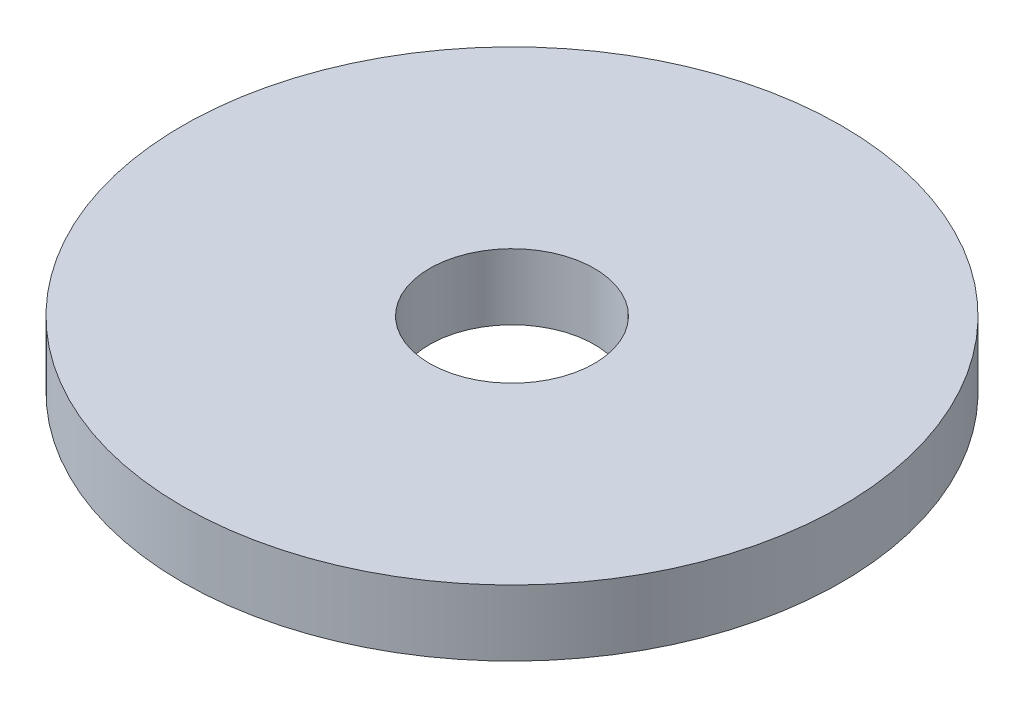
ISO-10303-21;
HEADER;
FILE_DESCRIPTION(('STEP AP214'),'2;1');
FILE_NAME('part.step','',(''),(''),'','','');
FILE_SCHEMA(('AUTOMOTIVE_DESIGN { 1 0 10303 214 1 1 1 1 }'));
ENDSEC;
DATA;
#1=APPLICATION_CONTEXT('core data for automotive mechanical design processes');
#2=APPLICATION_PROTOCOL_DEFINITION('international standard','automotive_design',2000,#1);
#3=PRODUCT_CONTEXT('',#1,'mechanical');
#4=PRODUCT('Part','Part','',(#3));
#5=PRODUCT_RELATED_PRODUCT_CATEGORY('part','',(#4));
#6=PRODUCT_DEFINITION_FORMATION('','',#4);
#7=PRODUCT_DEFINITION_CONTEXT('part definition',#1,'design');
#8=PRODUCT_DEFINITION('design','',#6,#7);
#9=PRODUCT_DEFINITION_SHAPE('','',#8);
#10=(LENGTH_UNIT() NAMED_UNIT(*) SI_UNIT(.MILLI.,.METRE.));
#11=(NAMED_UNIT(*) PLANE_ANGLE_UNIT() SI_UNIT($,.RADIAN.));
#12=(NAMED_UNIT(*) SI_UNIT($,.STERADIAN.) SOLID_ANGLE_UNIT());
#13=UNCERTAINTY_MEASURE_WITH_UNIT(LENGTH_MEASURE(1.E-05),#10,'distance_accuracy_value','');
#14=(GEOMETRIC_REPRESENTATION_CONTEXT(3) GLOBAL_UNCERTAINTY_ASSIGNED_CONTEXT((#13)) GLOBAL_UNIT_ASSIGNED_CONTEXT((#10,
#11,#12)) REPRESENTATION_CONTEXT('',''));
#15=CARTESIAN_POINT('',(0.,0.,0.));
#16=DIRECTION('',(0.,0.,1.));
#17=DIRECTION('',(1.,0.,0.));
#18=AXIS2_PLACEMENT_3D('',#15,#16,#17);
#19=CARTESIAN_POINT('',(0.,4.,0.));
#20=DIRECTION('',(0.,-1.,0.));
#21=DIRECTION('',(0.,0.,-1.));
#22=AXIS2_PLACEMENT_3D('',#19,#20,#21);
#23=CYLINDRICAL_SURFACE('',#22,20.);
#24=CARTESIAN_POINT('',(0.,4.,0.));
#25=DIRECTION('',(0.,1.,0.));
#26=DIRECTION('',(0.,0.,1.));
#27=AXIS2_PLACEMENT_3D('',#24,#25,#26);
#28=CIRCLE('',#27,20.);
#29=CARTESIAN_POINT('',(0.,4.,20.));
#30=VERTEX_POINT('',#29);
#31=EDGE_CURVE('E12',#30,#30,#28,.T.);
#32=ORIENTED_EDGE('',*,*,#31,.F.);
#33=EDGE_LOOP('',(#32));
#34=FACE_BOUND('',#33,.T.);
#35=CARTESIAN_POINT('',(0.,0.,0.));
#36=DIRECTION('',(0.,1.,0.));
#37=DIRECTION('',(0.,0.,1.));
#38=AXIS2_PLACEMENT_3D('',#35,#36,#37);
#39=CIRCLE('',#38,20.);
#40=CARTESIAN_POINT('',(0.,0.,20.));
#41=VERTEX_POINT('',#40);
#42=EDGE_CURVE('E52',#41,#41,#39,.T.);
#43=ORIENTED_EDGE('',*,*,#42,.T.);
#44=EDGE_LOOP('',(#43));
#45=FACE_BOUND('',#44,.T.);
#46=ADVANCED_FACE('F49',(#34,#45),#23,.T.);
#47=CARTESIAN_POINT('',(0.,4.,0.));
#48=DIRECTION('',(0.,1.,0.));
#49=DIRECTION('',(0.,0.,1.));
#50=AXIS2_PLACEMENT_3D('',#47,#48,#49);
#51=PLANE('',#50);
#52=CARTESIAN_POINT('',(0.,4.,0.));
#53=DIRECTION('',(0.,1.,0.));
#54=DIRECTION('',(0.,0.,1.));
#55=AXIS2_PLACEMENT_3D('',#52,#53,#54);
#56=CIRCLE('',#55,5.);
#57=CARTESIAN_POINT('',(0.,4.,5.));
#58=VERTEX_POINT('',#57);
#59=EDGE_CURVE('E63',#58,#58,#56,.T.);
#60=ORIENTED_EDGE('',*,*,#59,.F.);
#61=EDGE_LOOP('',(#60));
#62=FACE_BOUND('',#61,.T.);
#63=ORIENTED_EDGE('',*,*,#31,.T.);
#64=EDGE_LOOP('',(#63));
#65=FACE_BOUND('',#64,.T.);
#66=ADVANCED_FACE('F69',(#62,#65),#51,.T.);
#67=CARTESIAN_POINT('',(0.,0.,0.));
#68=DIRECTION('',(0.,1.,0.));
#69=DIRECTION('',(0.,0.,1.));
#70=AXIS2_PLACEMENT_3D('',#67,#68,#69);
#71=PLANE('',#70);
#72=CARTESIAN_POINT('',(0.,0.,0.));
#73=DIRECTION('',(0.,1.,0.));
#74=DIRECTION('',(0.,0.,1.));
#75=AXIS2_PLACEMENT_3D('',#72,#73,#74);
#76=CIRCLE('',#75,5.);
#77=CARTESIAN_POINT('',(0.,0.,5.));
#78=VERTEX_POINT('',#77);
#79=EDGE_CURVE('E59',#78,#78,#76,.T.);
#80=ORIENTED_EDGE('',*,*,#79,.T.);
#81=EDGE_LOOP('',(#80));
#82=FACE_BOUND('',#81,.T.);
#83=ORIENTED_EDGE('',*,*,#42,.F.);
#84=EDGE_LOOP('',(#83));
#85=FACE_BOUND('',#84,.T.);
#86=ADVANCED_FACE('F71',(#82,#85),#71,.F.);
#87=CARTESIAN_POINT('',(0.,4.,0.));
#88=DIRECTION('',(0.,1.,0.));
#89=DIRECTION('',(0.,0.,1.));
#90=AXIS2_PLACEMENT_3D('',#87,#88,#89);
#91=CYLINDRICAL_SURFACE('',#90,5.);
#92=ORIENTED_EDGE('',*,*,#79,.F.);
#93=EDGE_LOOP('',(#92));
#94=FACE_BOUND('',#93,.T.);
#95=ORIENTED_EDGE('',*,*,#59,.T.);
#96=EDGE_LOOP('',(#95));
#97=FACE_BOUND('',#96,.T.);
#98=ADVANCED_FACE('F67',(#94,#97),#91,.F.);
#99=CLOSED_SHELL('',(#46,#66,#86,#98));
#100=MANIFOLD_SOLID_BREP('B2',#99);
#101=ADVANCED_BREP_SHAPE_REPRESENTATION('',(#18,#100),#14);
#102=SHAPE_DEFINITION_REPRESENTATION(#9,#101);
ENDSEC;
END-ISO-10303-21;
